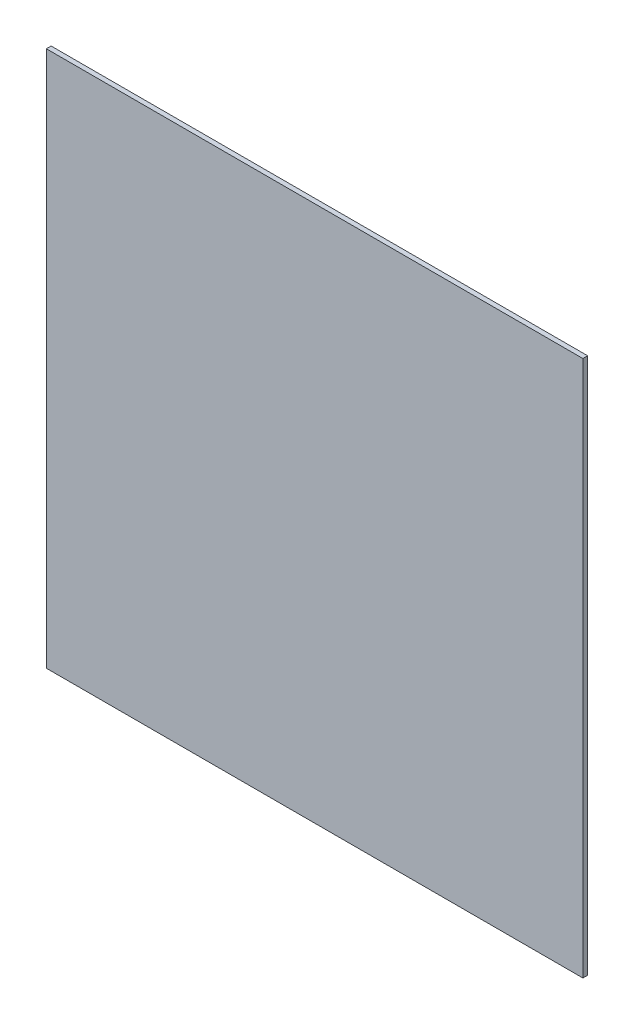
ISO-10303-21;
HEADER;
FILE_DESCRIPTION(('STEP AP214'),'2;1');
FILE_NAME('part.step','',(''),(''),'','','');
FILE_SCHEMA(('AUTOMOTIVE_DESIGN { 1 0 10303 214 1 1 1 1 }'));
ENDSEC;
DATA;
#1=APPLICATION_CONTEXT('core data for automotive mechanical design processes');
#2=APPLICATION_PROTOCOL_DEFINITION('international standard','automotive_design',2000,#1);
#3=PRODUCT_CONTEXT('',#1,'mechanical');
#4=PRODUCT('Part','Part','',(#3));
#5=PRODUCT_RELATED_PRODUCT_CATEGORY('part','',(#4));
#6=PRODUCT_DEFINITION_FORMATION('','',#4);
#7=PRODUCT_DEFINITION_CONTEXT('part definition',#1,'design');
#8=PRODUCT_DEFINITION('design','',#6,#7);
#9=PRODUCT_DEFINITION_SHAPE('','',#8);
#10=(LENGTH_UNIT() NAMED_UNIT(*) SI_UNIT(.MILLI.,.METRE.));
#11=(NAMED_UNIT(*) PLANE_ANGLE_UNIT() SI_UNIT($,.RADIAN.));
#12=(NAMED_UNIT(*) SI_UNIT($,.STERADIAN.) SOLID_ANGLE_UNIT());
#13=UNCERTAINTY_MEASURE_WITH_UNIT(LENGTH_MEASURE(1.E-05),#10,'distance_accuracy_value','');
#14=(GEOMETRIC_REPRESENTATION_CONTEXT(3) GLOBAL_UNCERTAINTY_ASSIGNED_CONTEXT((#13)) GLOBAL_UNIT_ASSIGNED_CONTEXT((#10,
#11,#12)) REPRESENTATION_CONTEXT('',''));
#15=CARTESIAN_POINT('',(0.,0.,0.));
#16=DIRECTION('',(0.,0.,1.));
#17=DIRECTION('',(1.,0.,0.));
#18=AXIS2_PLACEMENT_3D('',#15,#16,#17);
#19=CARTESIAN_POINT('',(-112.3,-112.3,2.));
#20=DIRECTION('',(1.,0.,0.));
#21=DIRECTION('',(0.,0.,-1.));
#22=AXIS2_PLACEMENT_3D('',#19,#20,#21);
#23=PLANE('',#22);
#24=DIRECTION('',(0.,-1.,0.));
#25=VECTOR('',#24,1.);
#26=CARTESIAN_POINT('',(-112.3,-112.3,0.));
#27=LINE('',#26,#25);
#28=CARTESIAN_POINT('',(-112.3,112.3,0.));
#29=VERTEX_POINT('',#28);
#30=CARTESIAN_POINT('',(-112.3,-112.3,0.));
#31=VERTEX_POINT('',#30);
#32=EDGE_CURVE('E96',#29,#31,#27,.T.);
#33=ORIENTED_EDGE('',*,*,#32,.T.);
#34=DIRECTION('',(0.,0.,-1.));
#35=VECTOR('',#34,1.);
#36=CARTESIAN_POINT('',(-112.3,-112.3,2.));
#37=LINE('',#36,#35);
#38=CARTESIAN_POINT('',(-112.3,-112.3,2.));
#39=VERTEX_POINT('',#38);
#40=EDGE_CURVE('E11',#39,#31,#37,.T.);
#41=ORIENTED_EDGE('',*,*,#40,.F.);
#42=DIRECTION('',(0.,-1.,0.));
#43=VECTOR('',#42,1.);
#44=CARTESIAN_POINT('',(-112.3,-112.3,2.));
#45=LINE('',#44,#43);
#46=CARTESIAN_POINT('',(-112.3,112.3,2.));
#47=VERTEX_POINT('',#46);
#48=EDGE_CURVE('E84',#47,#39,#45,.T.);
#49=ORIENTED_EDGE('',*,*,#48,.F.);
#50=DIRECTION('',(0.,0.,-1.));
#51=VECTOR('',#50,1.);
#52=CARTESIAN_POINT('',(-112.3,112.3,2.));
#53=LINE('',#52,#51);
#54=EDGE_CURVE('E92',#47,#29,#53,.T.);
#55=ORIENTED_EDGE('',*,*,#54,.T.);
#56=EDGE_LOOP('',(#33,#41,#49,#55));
#57=FACE_BOUND('',#56,.T.);
#58=ADVANCED_FACE('F33',(#57),#23,.F.);
#59=CARTESIAN_POINT('',(112.3,-112.3,2.));
#60=DIRECTION('',(0.,1.,0.));
#61=DIRECTION('',(-1.,0.,0.));
#62=AXIS2_PLACEMENT_3D('',#59,#60,#61);
#63=PLANE('',#62);
#64=DIRECTION('',(1.,0.,0.));
#65=VECTOR('',#64,1.);
#66=CARTESIAN_POINT('',(112.3,-112.3,0.));
#67=LINE('',#66,#65);
#68=CARTESIAN_POINT('',(112.3,-112.3,0.));
#69=VERTEX_POINT('',#68);
#70=EDGE_CURVE('E88',#31,#69,#67,.T.);
#71=ORIENTED_EDGE('',*,*,#70,.T.);
#72=DIRECTION('',(0.,0.,-1.));
#73=VECTOR('',#72,1.);
#74=CARTESIAN_POINT('',(112.3,-112.3,2.));
#75=LINE('',#74,#73);
#76=CARTESIAN_POINT('',(112.3,-112.3,2.));
#77=VERTEX_POINT('',#76);
#78=EDGE_CURVE('E41',#77,#69,#75,.T.);
#79=ORIENTED_EDGE('',*,*,#78,.F.);
#80=DIRECTION('',(1.,0.,0.));
#81=VECTOR('',#80,1.);
#82=CARTESIAN_POINT('',(112.3,-112.3,2.));
#83=LINE('',#82,#81);
#84=EDGE_CURVE('E79',#39,#77,#83,.T.);
#85=ORIENTED_EDGE('',*,*,#84,.F.);
#86=ORIENTED_EDGE('',*,*,#40,.T.);
#87=EDGE_LOOP('',(#71,#79,#85,#86));
#88=FACE_BOUND('',#87,.T.);
#89=ADVANCED_FACE('F87',(#88),#63,.F.);
#90=CARTESIAN_POINT('',(112.3,-112.3,2.));
#91=DIRECTION('',(-1.,0.,0.));
#92=DIRECTION('',(0.,0.,1.));
#93=AXIS2_PLACEMENT_3D('',#90,#91,#92);
#94=PLANE('',#93);
#95=DIRECTION('',(0.,1.,0.));
#96=VECTOR('',#95,1.);
#97=CARTESIAN_POINT('',(112.3,-112.3,0.));
#98=LINE('',#97,#96);
#99=CARTESIAN_POINT('',(112.3,112.3,0.));
#100=VERTEX_POINT('',#99);
#101=EDGE_CURVE('E66',#69,#100,#98,.T.);
#102=ORIENTED_EDGE('',*,*,#101,.T.);
#103=DIRECTION('',(0.,0.,-1.));
#104=VECTOR('',#103,1.);
#105=CARTESIAN_POINT('',(112.3,112.3,2.));
#106=LINE('',#105,#104);
#107=CARTESIAN_POINT('',(112.3,112.3,2.));
#108=VERTEX_POINT('',#107);
#109=EDGE_CURVE('E89',#108,#100,#106,.T.);
#110=ORIENTED_EDGE('',*,*,#109,.F.);
#111=DIRECTION('',(0.,1.,0.));
#112=VECTOR('',#111,1.);
#113=CARTESIAN_POINT('',(112.3,-112.3,2.));
#114=LINE('',#113,#112);
#115=EDGE_CURVE('E82',#77,#108,#114,.T.);
#116=ORIENTED_EDGE('',*,*,#115,.F.);
#117=ORIENTED_EDGE('',*,*,#78,.T.);
#118=EDGE_LOOP('',(#102,#110,#116,#117));
#119=FACE_BOUND('',#118,.T.);
#120=ADVANCED_FACE('F90',(#119),#94,.F.);
#121=CARTESIAN_POINT('',(112.3,112.3,2.));
#122=DIRECTION('',(0.,-1.,0.));
#123=DIRECTION('',(1.,0.,0.));
#124=AXIS2_PLACEMENT_3D('',#121,#122,#123);
#125=PLANE('',#124);
#126=DIRECTION('',(-1.,0.,0.));
#127=VECTOR('',#126,1.);
#128=CARTESIAN_POINT('',(112.3,112.3,0.));
#129=LINE('',#128,#127);
#130=EDGE_CURVE('E72',#100,#29,#129,.T.);
#131=ORIENTED_EDGE('',*,*,#130,.T.);
#132=ORIENTED_EDGE('',*,*,#54,.F.);
#133=DIRECTION('',(-1.,0.,0.));
#134=VECTOR('',#133,1.);
#135=CARTESIAN_POINT('',(112.3,112.3,2.));
#136=LINE('',#135,#134);
#137=EDGE_CURVE('E49',#108,#47,#136,.T.);
#138=ORIENTED_EDGE('',*,*,#137,.F.);
#139=ORIENTED_EDGE('',*,*,#109,.T.);
#140=EDGE_LOOP('',(#131,#132,#138,#139));
#141=FACE_BOUND('',#140,.T.);
#142=ADVANCED_FACE('F103',(#141),#125,.F.);
#143=CARTESIAN_POINT('',(0.,0.,2.));
#144=DIRECTION('',(0.,0.,1.));
#145=DIRECTION('',(1.,0.,0.));
#146=AXIS2_PLACEMENT_3D('',#143,#144,#145);
#147=PLANE('',#146);
#148=ORIENTED_EDGE('',*,*,#48,.T.);
#149=ORIENTED_EDGE('',*,*,#84,.T.);
#150=ORIENTED_EDGE('',*,*,#115,.T.);
#151=ORIENTED_EDGE('',*,*,#137,.T.);
#152=EDGE_LOOP('',(#148,#149,#150,#151));
#153=FACE_BOUND('',#152,.T.);
#154=ADVANCED_FACE('F80',(#153),#147,.T.);
#155=CARTESIAN_POINT('',(0.,0.,0.));
#156=DIRECTION('',(0.,0.,1.));
#157=DIRECTION('',(1.,0.,0.));
#158=AXIS2_PLACEMENT_3D('',#155,#156,#157);
#159=PLANE('',#158);
#160=ORIENTED_EDGE('',*,*,#32,.F.);
#161=ORIENTED_EDGE('',*,*,#130,.F.);
#162=ORIENTED_EDGE('',*,*,#101,.F.);
#163=ORIENTED_EDGE('',*,*,#70,.F.);
#164=EDGE_LOOP('',(#160,#161,#162,#163));
#165=FACE_BOUND('',#164,.T.);
#166=ADVANCED_FACE('F106',(#165),#159,.F.);
#167=CLOSED_SHELL('',(#58,#89,#120,#142,#154,#166));
#168=MANIFOLD_SOLID_BREP('B2',#167);
#169=ADVANCED_BREP_SHAPE_REPRESENTATION('',(#18,#168),#14);
#170=SHAPE_DEFINITION_REPRESENTATION(#9,#169);
ENDSEC;
END-ISO-10303-21;
